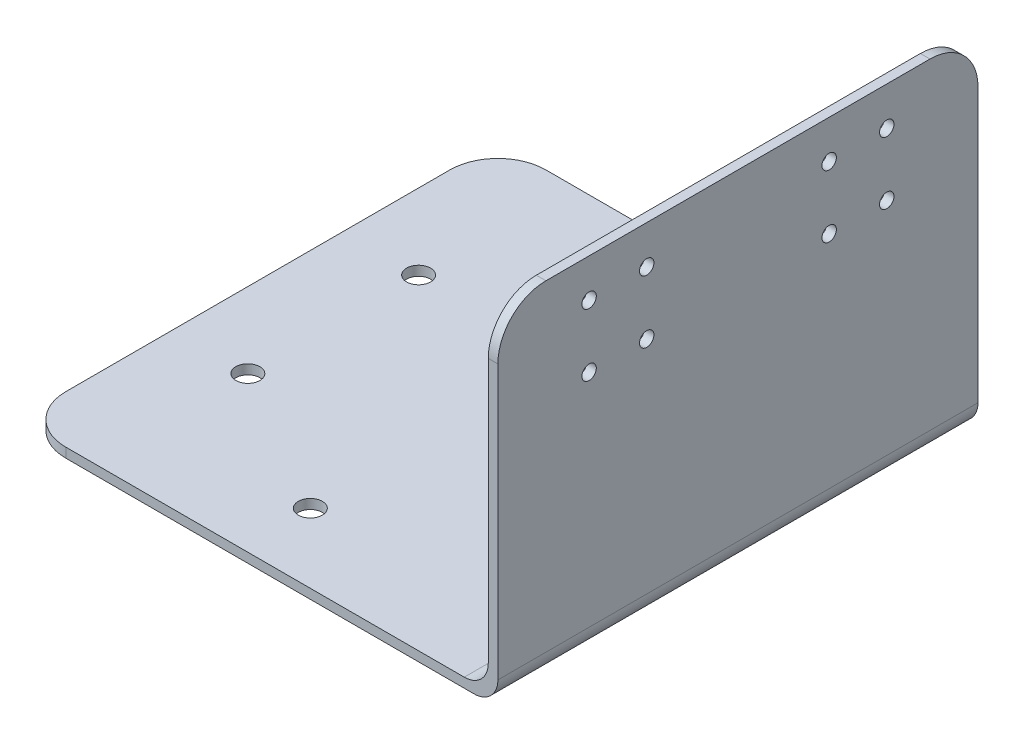
ISO-10303-21;
HEADER;
FILE_DESCRIPTION(('STEP AP214'),'2;1');
FILE_NAME('part.step','',(''),(''),'','','');
FILE_SCHEMA(('AUTOMOTIVE_DESIGN { 1 0 10303 214 1 1 1 1 }'));
ENDSEC;
DATA;
#1=APPLICATION_CONTEXT('core data for automotive mechanical design processes');
#2=APPLICATION_PROTOCOL_DEFINITION('international standard','automotive_design',2000,#1);
#3=PRODUCT_CONTEXT('',#1,'mechanical');
#4=PRODUCT('Part','Part','',(#3));
#5=PRODUCT_RELATED_PRODUCT_CATEGORY('part','',(#4));
#6=PRODUCT_DEFINITION_FORMATION('','',#4);
#7=PRODUCT_DEFINITION_CONTEXT('part definition',#1,'design');
#8=PRODUCT_DEFINITION('design','',#6,#7);
#9=PRODUCT_DEFINITION_SHAPE('','',#8);
#10=(LENGTH_UNIT() NAMED_UNIT(*) SI_UNIT(.MILLI.,.METRE.));
#11=(NAMED_UNIT(*) PLANE_ANGLE_UNIT() SI_UNIT($,.RADIAN.));
#12=(NAMED_UNIT(*) SI_UNIT($,.STERADIAN.) SOLID_ANGLE_UNIT());
#13=UNCERTAINTY_MEASURE_WITH_UNIT(LENGTH_MEASURE(1.E-05),#10,'distance_accuracy_value','');
#14=(GEOMETRIC_REPRESENTATION_CONTEXT(3) GLOBAL_UNCERTAINTY_ASSIGNED_CONTEXT((#13)) GLOBAL_UNIT_ASSIGNED_CONTEXT((#10,
#11,#12)) REPRESENTATION_CONTEXT('',''));
#15=CARTESIAN_POINT('',(0.,0.,0.));
#16=DIRECTION('',(0.,0.,1.));
#17=DIRECTION('',(1.,0.,0.));
#18=AXIS2_PLACEMENT_3D('',#15,#16,#17);
#19=CARTESIAN_POINT('',(-1.,25.,100.));
#20=DIRECTION('',(1.,0.,0.));
#21=DIRECTION('',(0.,1.,0.));
#22=AXIS2_PLACEMENT_3D('',#19,#20,#21);
#23=PLANE('',#22);
#24=CARTESIAN_POINT('',(-1.,4.00000000000003,19.));
#25=DIRECTION('',(-1.,0.,0.));
#26=DIRECTION('',(0.,-1.,0.));
#27=AXIS2_PLACEMENT_3D('',#24,#25,#26);
#28=CIRCLE('',#27,1.5);
#29=CARTESIAN_POINT('',(-1.,2.50000000000003,19.));
#30=VERTEX_POINT('',#29);
#31=EDGE_CURVE('E252',#30,#30,#28,.T.);
#32=ORIENTED_EDGE('',*,*,#31,.F.);
#33=EDGE_LOOP('',(#32));
#34=FACE_BOUND('',#33,.T.);
#35=CARTESIAN_POINT('',(-1.,17.,19.));
#36=DIRECTION('',(-1.,0.,0.));
#37=DIRECTION('',(0.,-1.,0.));
#38=AXIS2_PLACEMENT_3D('',#35,#36,#37);
#39=CIRCLE('',#38,1.5);
#40=CARTESIAN_POINT('',(-1.,15.5,19.));
#41=VERTEX_POINT('',#40);
#42=EDGE_CURVE('E246',#41,#41,#39,.T.);
#43=ORIENTED_EDGE('',*,*,#42,.F.);
#44=EDGE_LOOP('',(#43));
#45=FACE_BOUND('',#44,.T.);
#46=CARTESIAN_POINT('',(-1.,17.,81.));
#47=DIRECTION('',(-1.,0.,0.));
#48=DIRECTION('',(0.,1.,0.));
#49=AXIS2_PLACEMENT_3D('',#46,#47,#48);
#50=CIRCLE('',#49,1.5);
#51=CARTESIAN_POINT('',(-1.,18.5,81.));
#52=VERTEX_POINT('',#51);
#53=EDGE_CURVE('E240',#52,#52,#50,.T.);
#54=ORIENTED_EDGE('',*,*,#53,.F.);
#55=EDGE_LOOP('',(#54));
#56=FACE_BOUND('',#55,.T.);
#57=CARTESIAN_POINT('',(-1.,17.,69.));
#58=DIRECTION('',(-1.,0.,0.));
#59=DIRECTION('',(0.,1.,0.));
#60=AXIS2_PLACEMENT_3D('',#57,#58,#59);
#61=CIRCLE('',#60,1.50000000000001);
#62=CARTESIAN_POINT('',(-1.,18.5,69.));
#63=VERTEX_POINT('',#62);
#64=EDGE_CURVE('E233',#63,#63,#61,.T.);
#65=ORIENTED_EDGE('',*,*,#64,.F.);
#66=EDGE_LOOP('',(#65));
#67=FACE_BOUND('',#66,.T.);
#68=CARTESIAN_POINT('',(-1.,4.00000000000003,69.));
#69=DIRECTION('',(-1.,0.,0.));
#70=DIRECTION('',(0.,1.,0.));
#71=AXIS2_PLACEMENT_3D('',#68,#69,#70);
#72=CIRCLE('',#71,1.49999999999995);
#73=CARTESIAN_POINT('',(-1.,5.49999999999999,69.));
#74=VERTEX_POINT('',#73);
#75=EDGE_CURVE('E270',#74,#74,#72,.T.);
#76=ORIENTED_EDGE('',*,*,#75,.F.);
#77=EDGE_LOOP('',(#76));
#78=FACE_BOUND('',#77,.T.);
#79=CARTESIAN_POINT('',(-1.,4.00000000000003,31.));
#80=DIRECTION('',(-1.,0.,0.));
#81=DIRECTION('',(0.,-1.,0.));
#82=AXIS2_PLACEMENT_3D('',#79,#80,#81);
#83=CIRCLE('',#82,1.49999999999996);
#84=CARTESIAN_POINT('',(-1.,2.50000000000007,31.));
#85=VERTEX_POINT('',#84);
#86=EDGE_CURVE('E264',#85,#85,#83,.T.);
#87=ORIENTED_EDGE('',*,*,#86,.F.);
#88=EDGE_LOOP('',(#87));
#89=FACE_BOUND('',#88,.T.);
#90=CARTESIAN_POINT('',(-1.,4.00000000000004,81.));
#91=DIRECTION('',(-1.,0.,0.));
#92=DIRECTION('',(0.,1.,0.));
#93=AXIS2_PLACEMENT_3D('',#90,#91,#92);
#94=CIRCLE('',#93,1.5);
#95=CARTESIAN_POINT('',(-1.,5.50000000000003,81.));
#96=VERTEX_POINT('',#95);
#97=EDGE_CURVE('E257',#96,#96,#94,.T.);
#98=ORIENTED_EDGE('',*,*,#97,.F.);
#99=EDGE_LOOP('',(#98));
#100=FACE_BOUND('',#99,.T.);
#101=CARTESIAN_POINT('',(-1.,17.,31.));
#102=DIRECTION('',(-1.,0.,0.));
#103=DIRECTION('',(0.,-1.,0.));
#104=AXIS2_PLACEMENT_3D('',#101,#102,#103);
#105=CIRCLE('',#104,1.5);
#106=CARTESIAN_POINT('',(-1.,15.5,31.));
#107=VERTEX_POINT('',#106);
#108=EDGE_CURVE('E227',#107,#107,#105,.T.);
#109=ORIENTED_EDGE('',*,*,#108,.F.);
#110=EDGE_LOOP('',(#109));
#111=FACE_BOUND('',#110,.T.);
#112=DIRECTION('',(0.,0.,-1.));
#113=VECTOR('',#112,1.);
#114=CARTESIAN_POINT('',(-1.,25.,100.));
#115=LINE('',#114,#113);
#116=CARTESIAN_POINT('',(-1.,25.,90.));
#117=VERTEX_POINT('',#116);
#118=CARTESIAN_POINT('',(-1.,25.,9.99999999999999));
#119=VERTEX_POINT('',#118);
#120=EDGE_CURVE('E208',#117,#119,#115,.T.);
#121=ORIENTED_EDGE('',*,*,#120,.T.);
#122=CARTESIAN_POINT('',(-1.,15.,9.99999999999999));
#123=DIRECTION('',(1.,0.,0.));
#124=DIRECTION('',(0.,1.,0.));
#125=AXIS2_PLACEMENT_3D('',#122,#123,#124);
#126=CIRCLE('',#125,10.);
#127=CARTESIAN_POINT('',(-1.,15.,0.));
#128=VERTEX_POINT('',#127);
#129=EDGE_CURVE('E162',#119,#128,#126,.F.);
#130=ORIENTED_EDGE('',*,*,#129,.T.);
#131=DIRECTION('',(0.,-1.,0.));
#132=VECTOR('',#131,1.);
#133=CARTESIAN_POINT('',(-1.,25.,0.));
#134=LINE('',#133,#132);
#135=CARTESIAN_POINT('',(-0.999999999999997,-40.,0.));
#136=VERTEX_POINT('',#135);
#137=EDGE_CURVE('E148',#128,#136,#134,.T.);
#138=ORIENTED_EDGE('',*,*,#137,.T.);
#139=DIRECTION('',(0.,0.,-1.));
#140=VECTOR('',#139,1.);
#141=CARTESIAN_POINT('',(-0.999999999999997,-40.,100.));
#142=LINE('',#141,#140);
#143=CARTESIAN_POINT('',(-0.999999999999997,-40.,100.));
#144=VERTEX_POINT('',#143);
#145=EDGE_CURVE('E140',#144,#136,#142,.T.);
#146=ORIENTED_EDGE('',*,*,#145,.F.);
#147=DIRECTION('',(0.,-1.,0.));
#148=VECTOR('',#147,1.);
#149=CARTESIAN_POINT('',(-1.,25.,100.));
#150=LINE('',#149,#148);
#151=CARTESIAN_POINT('',(-1.,15.,100.));
#152=VERTEX_POINT('',#151);
#153=EDGE_CURVE('E124',#152,#144,#150,.T.);
#154=ORIENTED_EDGE('',*,*,#153,.F.);
#155=CARTESIAN_POINT('',(-1.,15.,90.));
#156=DIRECTION('',(1.,0.,0.));
#157=DIRECTION('',(0.,1.,0.));
#158=AXIS2_PLACEMENT_3D('',#155,#156,#157);
#159=CIRCLE('',#158,10.);
#160=EDGE_CURVE('E160',#152,#117,#159,.F.);
#161=ORIENTED_EDGE('',*,*,#160,.T.);
#162=EDGE_LOOP('',(#121,#130,#138,#146,#154,#161));
#163=FACE_BOUND('',#162,.T.);
#164=ADVANCED_FACE('F35',(#34,#45,#56,#67,#78,#89,#100,#111,#163),#23,.F.);
#165=CARTESIAN_POINT('',(-6.,-40.,100.));
#166=DIRECTION('',(0.,0.,-1.));
#167=DIRECTION('',(-1.,0.,0.));
#168=AXIS2_PLACEMENT_3D('',#165,#166,#167);
#169=CYLINDRICAL_SURFACE('',#168,5.);
#170=CARTESIAN_POINT('',(-6.,-40.,0.));
#171=DIRECTION('',(0.,0.,-1.));
#172=DIRECTION('',(-1.,0.,0.));
#173=AXIS2_PLACEMENT_3D('',#170,#171,#172);
#174=CIRCLE('',#173,5.);
#175=CARTESIAN_POINT('',(-5.99999999999999,-45.,0.));
#176=VERTEX_POINT('',#175);
#177=EDGE_CURVE('E219',#136,#176,#174,.T.);
#178=ORIENTED_EDGE('',*,*,#177,.T.);
#179=DIRECTION('',(0.,0.,-1.));
#180=VECTOR('',#179,1.);
#181=CARTESIAN_POINT('',(-5.99999999999999,-45.,100.));
#182=LINE('',#181,#180);
#183=CARTESIAN_POINT('',(-5.99999999999999,-45.,100.));
#184=VERTEX_POINT('',#183);
#185=EDGE_CURVE('E142',#184,#176,#182,.T.);
#186=ORIENTED_EDGE('',*,*,#185,.F.);
#187=CARTESIAN_POINT('',(-6.,-40.,100.));
#188=DIRECTION('',(0.,0.,-1.));
#189=DIRECTION('',(-1.,0.,0.));
#190=AXIS2_PLACEMENT_3D('',#187,#188,#189);
#191=CIRCLE('',#190,5.);
#192=EDGE_CURVE('E129',#144,#184,#191,.T.);
#193=ORIENTED_EDGE('',*,*,#192,.F.);
#194=ORIENTED_EDGE('',*,*,#145,.T.);
#195=EDGE_LOOP('',(#178,#186,#193,#194));
#196=FACE_BOUND('',#195,.T.);
#197=ADVANCED_FACE('F139',(#196),#169,.F.);
#198=CARTESIAN_POINT('',(-5.99999999999999,-45.,100.));
#199=DIRECTION('',(0.,-1.,0.));
#200=DIRECTION('',(1.,0.,0.));
#201=AXIS2_PLACEMENT_3D('',#198,#199,#200);
#202=PLANE('',#201);
#203=CARTESIAN_POINT('',(-52.5000000000061,-45.,14.4400000000013));
#204=DIRECTION('',(0.,1.,0.));
#205=DIRECTION('',(-1.,0.,0.));
#206=AXIS2_PLACEMENT_3D('',#203,#204,#205);
#207=CIRCLE('',#206,2.5);
#208=CARTESIAN_POINT('',(-55.0000000000061,-45.,14.4400000000013));
#209=VERTEX_POINT('',#208);
#210=EDGE_CURVE('E281',#209,#209,#207,.T.);
#211=ORIENTED_EDGE('',*,*,#210,.F.);
#212=EDGE_LOOP('',(#211));
#213=FACE_BOUND('',#212,.T.);
#214=CARTESIAN_POINT('',(-83.2958633585773,-45.,32.2200000000073));
#215=DIRECTION('',(0.,1.,0.));
#216=DIRECTION('',(-1.,0.,0.));
#217=AXIS2_PLACEMENT_3D('',#214,#215,#216);
#218=CIRCLE('',#217,2.5);
#219=CARTESIAN_POINT('',(-85.7958633585773,-45.,32.2200000000073));
#220=VERTEX_POINT('',#219);
#221=EDGE_CURVE('E287',#220,#220,#218,.T.);
#222=ORIENTED_EDGE('',*,*,#221,.F.);
#223=EDGE_LOOP('',(#222));
#224=FACE_BOUND('',#223,.T.);
#225=CARTESIAN_POINT('',(-83.2958633585704,-45.,67.7800000000074));
#226=DIRECTION('',(0.,1.,0.));
#227=DIRECTION('',(-1.,0.,0.));
#228=AXIS2_PLACEMENT_3D('',#225,#226,#227);
#229=CIRCLE('',#228,2.49999999999999);
#230=CARTESIAN_POINT('',(-85.7958633585704,-45.,67.7800000000074));
#231=VERTEX_POINT('',#230);
#232=EDGE_CURVE('E293',#231,#231,#229,.T.);
#233=ORIENTED_EDGE('',*,*,#232,.F.);
#234=EDGE_LOOP('',(#233));
#235=FACE_BOUND('',#234,.T.);
#236=CARTESIAN_POINT('',(-52.4999999999922,-45.,85.5600000000013));
#237=DIRECTION('',(0.,1.,0.));
#238=DIRECTION('',(-1.,0.,0.));
#239=AXIS2_PLACEMENT_3D('',#236,#237,#238);
#240=CIRCLE('',#239,2.5);
#241=CARTESIAN_POINT('',(-54.9999999999922,-45.,85.5600000000013));
#242=VERTEX_POINT('',#241);
#243=EDGE_CURVE('E299',#242,#242,#240,.T.);
#244=ORIENTED_EDGE('',*,*,#243,.F.);
#245=EDGE_LOOP('',(#244));
#246=FACE_BOUND('',#245,.T.);
#247=CARTESIAN_POINT('',(-21.7041366414211,-45.,67.7799999999951));
#248=DIRECTION('',(0.,1.,0.));
#249=DIRECTION('',(-1.,0.,0.));
#250=AXIS2_PLACEMENT_3D('',#247,#248,#249);
#251=CIRCLE('',#250,2.5);
#252=CARTESIAN_POINT('',(-24.2041366414211,-45.,67.7799999999951));
#253=VERTEX_POINT('',#252);
#254=EDGE_CURVE('E305',#253,#253,#251,.T.);
#255=ORIENTED_EDGE('',*,*,#254,.F.);
#256=EDGE_LOOP('',(#255));
#257=FACE_BOUND('',#256,.T.);
#258=CARTESIAN_POINT('',(-21.7041366414283,-45.,32.2199999999951));
#259=DIRECTION('',(0.,1.,0.));
#260=DIRECTION('',(-1.,0.,0.));
#261=AXIS2_PLACEMENT_3D('',#258,#259,#260);
#262=CIRCLE('',#261,2.5);
#263=CARTESIAN_POINT('',(-24.2041366414283,-45.,32.2199999999951));
#264=VERTEX_POINT('',#263);
#265=EDGE_CURVE('E275',#264,#264,#262,.T.);
#266=ORIENTED_EDGE('',*,*,#265,.F.);
#267=EDGE_LOOP('',(#266));
#268=FACE_BOUND('',#267,.T.);
#269=DIRECTION('',(-1.,0.,0.));
#270=VECTOR('',#269,1.);
#271=CARTESIAN_POINT('',(-5.99999999999999,-45.,0.));
#272=LINE('',#271,#270);
#273=CARTESIAN_POINT('',(-89.,-45.,0.));
#274=VERTEX_POINT('',#273);
#275=EDGE_CURVE('E217',#176,#274,#272,.T.);
#276=ORIENTED_EDGE('',*,*,#275,.T.);
#277=CARTESIAN_POINT('',(-89.,-45.,9.99999999999999));
#278=DIRECTION('',(0.,-1.,0.));
#279=DIRECTION('',(1.,0.,0.));
#280=AXIS2_PLACEMENT_3D('',#277,#278,#279);
#281=CIRCLE('',#280,10.);
#282=CARTESIAN_POINT('',(-99.,-45.,9.99999999999999));
#283=VERTEX_POINT('',#282);
#284=EDGE_CURVE('E11',#274,#283,#281,.F.);
#285=ORIENTED_EDGE('',*,*,#284,.T.);
#286=DIRECTION('',(0.,0.,-1.));
#287=VECTOR('',#286,1.);
#288=CARTESIAN_POINT('',(-99.,-45.,100.));
#289=LINE('',#288,#287);
#290=CARTESIAN_POINT('',(-99.,-45.,90.));
#291=VERTEX_POINT('',#290);
#292=EDGE_CURVE('E154',#291,#283,#289,.T.);
#293=ORIENTED_EDGE('',*,*,#292,.F.);
#294=CARTESIAN_POINT('',(-89.,-45.,90.));
#295=DIRECTION('',(0.,-1.,0.));
#296=DIRECTION('',(1.,0.,0.));
#297=AXIS2_PLACEMENT_3D('',#294,#295,#296);
#298=CIRCLE('',#297,10.);
#299=CARTESIAN_POINT('',(-89.,-45.,100.));
#300=VERTEX_POINT('',#299);
#301=EDGE_CURVE('E43',#291,#300,#298,.F.);
#302=ORIENTED_EDGE('',*,*,#301,.T.);
#303=DIRECTION('',(-1.,0.,0.));
#304=VECTOR('',#303,1.);
#305=CARTESIAN_POINT('',(-5.99999999999999,-45.,100.));
#306=LINE('',#305,#304);
#307=EDGE_CURVE('E144',#184,#300,#306,.T.);
#308=ORIENTED_EDGE('',*,*,#307,.F.);
#309=ORIENTED_EDGE('',*,*,#185,.T.);
#310=EDGE_LOOP('',(#276,#285,#293,#302,#308,#309));
#311=FACE_BOUND('',#310,.T.);
#312=ADVANCED_FACE('F184',(#213,#224,#235,#246,#257,#268,#311),#202,.F.);
#313=CARTESIAN_POINT('',(-99.,-45.,100.));
#314=DIRECTION('',(1.,0.,0.));
#315=DIRECTION('',(0.,0.,-1.));
#316=AXIS2_PLACEMENT_3D('',#313,#314,#315);
#317=PLANE('',#316);
#318=ORIENTED_EDGE('',*,*,#292,.T.);
#319=DIRECTION('',(0.,-1.,0.));
#320=VECTOR('',#319,1.);
#321=CARTESIAN_POINT('',(-99.,-47.,9.99999999999999));
#322=LINE('',#321,#320);
#323=CARTESIAN_POINT('',(-99.,-47.,9.99999999999999));
#324=VERTEX_POINT('',#323);
#325=EDGE_CURVE('E177',#283,#324,#322,.T.);
#326=ORIENTED_EDGE('',*,*,#325,.T.);
#327=DIRECTION('',(0.,0.,-1.));
#328=VECTOR('',#327,1.);
#329=CARTESIAN_POINT('',(-99.,-47.,100.));
#330=LINE('',#329,#328);
#331=CARTESIAN_POINT('',(-99.,-47.,90.));
#332=VERTEX_POINT('',#331);
#333=EDGE_CURVE('E193',#332,#324,#330,.T.);
#334=ORIENTED_EDGE('',*,*,#333,.F.);
#335=DIRECTION('',(0.,-1.,0.));
#336=VECTOR('',#335,1.);
#337=CARTESIAN_POINT('',(-99.,-45.,90.));
#338=LINE('',#337,#336);
#339=EDGE_CURVE('E55',#332,#291,#338,.F.);
#340=ORIENTED_EDGE('',*,*,#339,.T.);
#341=EDGE_LOOP('',(#318,#326,#334,#340));
#342=FACE_BOUND('',#341,.T.);
#343=ADVANCED_FACE('F195',(#342),#317,.F.);
#344=CARTESIAN_POINT('',(-3.99999999999999,-47.,100.));
#345=DIRECTION('',(0.,1.,0.));
#346=DIRECTION('',(-1.,0.,0.));
#347=AXIS2_PLACEMENT_3D('',#344,#345,#346);
#348=PLANE('',#347);
#349=CARTESIAN_POINT('',(-52.5000000000061,-47.,14.4400000000013));
#350=DIRECTION('',(0.,1.,0.));
#351=DIRECTION('',(-1.,0.,0.));
#352=AXIS2_PLACEMENT_3D('',#349,#350,#351);
#353=CIRCLE('',#352,2.5);
#354=CARTESIAN_POINT('',(-55.0000000000061,-47.,14.4400000000013));
#355=VERTEX_POINT('',#354);
#356=EDGE_CURVE('E284',#355,#355,#353,.T.);
#357=ORIENTED_EDGE('',*,*,#356,.T.);
#358=EDGE_LOOP('',(#357));
#359=FACE_BOUND('',#358,.T.);
#360=CARTESIAN_POINT('',(-83.2958633585773,-47.,32.2200000000073));
#361=DIRECTION('',(0.,1.,0.));
#362=DIRECTION('',(-1.,0.,0.));
#363=AXIS2_PLACEMENT_3D('',#360,#361,#362);
#364=CIRCLE('',#363,2.5);
#365=CARTESIAN_POINT('',(-85.7958633585773,-47.,32.2200000000073));
#366=VERTEX_POINT('',#365);
#367=EDGE_CURVE('E290',#366,#366,#364,.T.);
#368=ORIENTED_EDGE('',*,*,#367,.T.);
#369=EDGE_LOOP('',(#368));
#370=FACE_BOUND('',#369,.T.);
#371=CARTESIAN_POINT('',(-83.2958633585704,-47.,67.7800000000074));
#372=DIRECTION('',(0.,1.,0.));
#373=DIRECTION('',(-1.,0.,0.));
#374=AXIS2_PLACEMENT_3D('',#371,#372,#373);
#375=CIRCLE('',#374,2.49999999999999);
#376=CARTESIAN_POINT('',(-85.7958633585704,-47.,67.7800000000074));
#377=VERTEX_POINT('',#376);
#378=EDGE_CURVE('E296',#377,#377,#375,.T.);
#379=ORIENTED_EDGE('',*,*,#378,.T.);
#380=EDGE_LOOP('',(#379));
#381=FACE_BOUND('',#380,.T.);
#382=CARTESIAN_POINT('',(-52.4999999999922,-47.,85.5600000000013));
#383=DIRECTION('',(0.,1.,0.));
#384=DIRECTION('',(-1.,0.,0.));
#385=AXIS2_PLACEMENT_3D('',#382,#383,#384);
#386=CIRCLE('',#385,2.5);
#387=CARTESIAN_POINT('',(-54.9999999999922,-47.,85.5600000000013));
#388=VERTEX_POINT('',#387);
#389=EDGE_CURVE('E302',#388,#388,#386,.T.);
#390=ORIENTED_EDGE('',*,*,#389,.T.);
#391=EDGE_LOOP('',(#390));
#392=FACE_BOUND('',#391,.T.);
#393=CARTESIAN_POINT('',(-21.7041366414211,-47.,67.7799999999951));
#394=DIRECTION('',(0.,1.,0.));
#395=DIRECTION('',(-1.,0.,0.));
#396=AXIS2_PLACEMENT_3D('',#393,#394,#395);
#397=CIRCLE('',#396,2.5);
#398=CARTESIAN_POINT('',(-24.2041366414211,-47.,67.7799999999951));
#399=VERTEX_POINT('',#398);
#400=EDGE_CURVE('E278',#399,#399,#397,.T.);
#401=ORIENTED_EDGE('',*,*,#400,.T.);
#402=EDGE_LOOP('',(#401));
#403=FACE_BOUND('',#402,.T.);
#404=CARTESIAN_POINT('',(-21.7041366414283,-47.,32.2199999999951));
#405=DIRECTION('',(0.,1.,0.));
#406=DIRECTION('',(-1.,0.,0.));
#407=AXIS2_PLACEMENT_3D('',#404,#405,#406);
#408=CIRCLE('',#407,2.5);
#409=CARTESIAN_POINT('',(-24.2041366414283,-47.,32.2199999999951));
#410=VERTEX_POINT('',#409);
#411=EDGE_CURVE('E261',#410,#410,#408,.T.);
#412=ORIENTED_EDGE('',*,*,#411,.T.);
#413=EDGE_LOOP('',(#412));
#414=FACE_BOUND('',#413,.T.);
#415=ORIENTED_EDGE('',*,*,#333,.T.);
#416=CARTESIAN_POINT('',(-89.,-47.,9.99999999999999));
#417=DIRECTION('',(0.,1.,0.));
#418=DIRECTION('',(-1.,0.,0.));
#419=AXIS2_PLACEMENT_3D('',#416,#417,#418);
#420=CIRCLE('',#419,10.);
#421=CARTESIAN_POINT('',(-89.,-47.,0.));
#422=VERTEX_POINT('',#421);
#423=EDGE_CURVE('E182',#324,#422,#420,.F.);
#424=ORIENTED_EDGE('',*,*,#423,.T.);
#425=DIRECTION('',(1.,0.,0.));
#426=VECTOR('',#425,1.);
#427=CARTESIAN_POINT('',(-3.99999999999999,-47.,0.));
#428=LINE('',#427,#426);
#429=CARTESIAN_POINT('',(-3.99999999999999,-47.,0.));
#430=VERTEX_POINT('',#429);
#431=EDGE_CURVE('E215',#422,#430,#428,.T.);
#432=ORIENTED_EDGE('',*,*,#431,.T.);
#433=DIRECTION('',(0.,0.,-1.));
#434=VECTOR('',#433,1.);
#435=CARTESIAN_POINT('',(-3.99999999999999,-47.,100.));
#436=LINE('',#435,#434);
#437=CARTESIAN_POINT('',(-3.99999999999999,-47.,100.));
#438=VERTEX_POINT('',#437);
#439=EDGE_CURVE('E197',#438,#430,#436,.T.);
#440=ORIENTED_EDGE('',*,*,#439,.F.);
#441=DIRECTION('',(1.,0.,0.));
#442=VECTOR('',#441,1.);
#443=CARTESIAN_POINT('',(-3.99999999999999,-47.,100.));
#444=LINE('',#443,#442);
#445=CARTESIAN_POINT('',(-89.,-47.,100.));
#446=VERTEX_POINT('',#445);
#447=EDGE_CURVE('E188',#446,#438,#444,.T.);
#448=ORIENTED_EDGE('',*,*,#447,.F.);
#449=CARTESIAN_POINT('',(-89.,-47.,90.));
#450=DIRECTION('',(0.,1.,0.));
#451=DIRECTION('',(-1.,0.,0.));
#452=AXIS2_PLACEMENT_3D('',#449,#450,#451);
#453=CIRCLE('',#452,10.);
#454=EDGE_CURVE('E180',#446,#332,#453,.F.);
#455=ORIENTED_EDGE('',*,*,#454,.T.);
#456=EDGE_LOOP('',(#415,#424,#432,#440,#448,#455));
#457=FACE_BOUND('',#456,.T.);
#458=ADVANCED_FACE('F192',(#359,#370,#381,#392,#403,#414,#457),#348,.F.);
#459=CARTESIAN_POINT('',(-3.99999999999999,-42.,100.));
#460=DIRECTION('',(0.,0.,-1.));
#461=DIRECTION('',(-1.,0.,0.));
#462=AXIS2_PLACEMENT_3D('',#459,#460,#461);
#463=CYLINDRICAL_SURFACE('',#462,5.);
#464=CARTESIAN_POINT('',(-3.99999999999999,-42.,0.));
#465=DIRECTION('',(0.,0.,1.));
#466=DIRECTION('',(1.,0.,0.));
#467=AXIS2_PLACEMENT_3D('',#464,#465,#466);
#468=CIRCLE('',#467,5.);
#469=CARTESIAN_POINT('',(1.00000000000001,-42.,0.));
#470=VERTEX_POINT('',#469);
#471=EDGE_CURVE('E213',#430,#470,#468,.T.);
#472=ORIENTED_EDGE('',*,*,#471,.T.);
#473=DIRECTION('',(0.,0.,-1.));
#474=VECTOR('',#473,1.);
#475=CARTESIAN_POINT('',(1.00000000000001,-42.,100.));
#476=LINE('',#475,#474);
#477=CARTESIAN_POINT('',(1.00000000000001,-42.,100.));
#478=VERTEX_POINT('',#477);
#479=EDGE_CURVE('E200',#478,#470,#476,.T.);
#480=ORIENTED_EDGE('',*,*,#479,.F.);
#481=CARTESIAN_POINT('',(-3.99999999999999,-42.,100.));
#482=DIRECTION('',(0.,0.,1.));
#483=DIRECTION('',(1.,0.,0.));
#484=AXIS2_PLACEMENT_3D('',#481,#482,#483);
#485=CIRCLE('',#484,5.);
#486=EDGE_CURVE('E224',#438,#478,#485,.T.);
#487=ORIENTED_EDGE('',*,*,#486,.F.);
#488=ORIENTED_EDGE('',*,*,#439,.T.);
#489=EDGE_LOOP('',(#472,#480,#487,#488));
#490=FACE_BOUND('',#489,.T.);
#491=ADVANCED_FACE('F373',(#490),#463,.T.);
#492=CARTESIAN_POINT('',(0.999999999999997,25.,100.));
#493=DIRECTION('',(-1.,0.,0.));
#494=DIRECTION('',(0.,-1.,0.));
#495=AXIS2_PLACEMENT_3D('',#492,#493,#494);
#496=PLANE('',#495);
#497=CARTESIAN_POINT('',(1.00000000000001,4.00000000000003,19.));
#498=DIRECTION('',(-1.,0.,0.));
#499=DIRECTION('',(0.,-1.,0.));
#500=AXIS2_PLACEMENT_3D('',#497,#498,#499);
#501=CIRCLE('',#500,1.5);
#502=CARTESIAN_POINT('',(1.00000000000001,2.50000000000003,19.));
#503=VERTEX_POINT('',#502);
#504=EDGE_CURVE('E230',#503,#503,#501,.T.);
#505=ORIENTED_EDGE('',*,*,#504,.T.);
#506=EDGE_LOOP('',(#505));
#507=FACE_BOUND('',#506,.T.);
#508=CARTESIAN_POINT('',(1.00000000000001,17.,19.));
#509=DIRECTION('',(-1.,0.,0.));
#510=DIRECTION('',(0.,-1.,0.));
#511=AXIS2_PLACEMENT_3D('',#508,#509,#510);
#512=CIRCLE('',#511,1.5);
#513=CARTESIAN_POINT('',(1.00000000000001,15.5,19.));
#514=VERTEX_POINT('',#513);
#515=EDGE_CURVE('E249',#514,#514,#512,.T.);
#516=ORIENTED_EDGE('',*,*,#515,.T.);
#517=EDGE_LOOP('',(#516));
#518=FACE_BOUND('',#517,.T.);
#519=CARTESIAN_POINT('',(1.00000000000001,17.,81.));
#520=DIRECTION('',(-1.,0.,0.));
#521=DIRECTION('',(0.,1.,0.));
#522=AXIS2_PLACEMENT_3D('',#519,#520,#521);
#523=CIRCLE('',#522,1.5);
#524=CARTESIAN_POINT('',(1.00000000000001,18.5,81.));
#525=VERTEX_POINT('',#524);
#526=EDGE_CURVE('E243',#525,#525,#523,.T.);
#527=ORIENTED_EDGE('',*,*,#526,.T.);
#528=EDGE_LOOP('',(#527));
#529=FACE_BOUND('',#528,.T.);
#530=CARTESIAN_POINT('',(1.00000000000001,17.,69.));
#531=DIRECTION('',(-1.,0.,0.));
#532=DIRECTION('',(0.,1.,0.));
#533=AXIS2_PLACEMENT_3D('',#530,#531,#532);
#534=CIRCLE('',#533,1.50000000000001);
#535=CARTESIAN_POINT('',(1.00000000000001,18.5,69.));
#536=VERTEX_POINT('',#535);
#537=EDGE_CURVE('E236',#536,#536,#534,.T.);
#538=ORIENTED_EDGE('',*,*,#537,.T.);
#539=EDGE_LOOP('',(#538));
#540=FACE_BOUND('',#539,.T.);
#541=CARTESIAN_POINT('',(1.00000000000001,4.00000000000003,69.));
#542=DIRECTION('',(-1.,0.,0.));
#543=DIRECTION('',(0.,1.,0.));
#544=AXIS2_PLACEMENT_3D('',#541,#542,#543);
#545=CIRCLE('',#544,1.49999999999995);
#546=CARTESIAN_POINT('',(1.00000000000001,5.49999999999999,69.));
#547=VERTEX_POINT('',#546);
#548=EDGE_CURVE('E237',#547,#547,#545,.T.);
#549=ORIENTED_EDGE('',*,*,#548,.T.);
#550=EDGE_LOOP('',(#549));
#551=FACE_BOUND('',#550,.T.);
#552=CARTESIAN_POINT('',(1.00000000000001,4.00000000000003,31.));
#553=DIRECTION('',(-1.,0.,0.));
#554=DIRECTION('',(0.,-1.,0.));
#555=AXIS2_PLACEMENT_3D('',#552,#553,#554);
#556=CIRCLE('',#555,1.49999999999996);
#557=CARTESIAN_POINT('',(1.00000000000001,2.50000000000007,31.));
#558=VERTEX_POINT('',#557);
#559=EDGE_CURVE('E267',#558,#558,#556,.T.);
#560=ORIENTED_EDGE('',*,*,#559,.T.);
#561=EDGE_LOOP('',(#560));
#562=FACE_BOUND('',#561,.T.);
#563=CARTESIAN_POINT('',(1.00000000000001,4.00000000000004,81.));
#564=DIRECTION('',(-1.,0.,0.));
#565=DIRECTION('',(0.,1.,0.));
#566=AXIS2_PLACEMENT_3D('',#563,#564,#565);
#567=CIRCLE('',#566,1.5);
#568=CARTESIAN_POINT('',(1.00000000000001,5.50000000000003,81.));
#569=VERTEX_POINT('',#568);
#570=EDGE_CURVE('E260',#569,#569,#567,.T.);
#571=ORIENTED_EDGE('',*,*,#570,.T.);
#572=EDGE_LOOP('',(#571));
#573=FACE_BOUND('',#572,.T.);
#574=CARTESIAN_POINT('',(1.00000000000001,17.,31.));
#575=DIRECTION('',(-1.,0.,0.));
#576=DIRECTION('',(0.,-1.,0.));
#577=AXIS2_PLACEMENT_3D('',#574,#575,#576);
#578=CIRCLE('',#577,1.5);
#579=CARTESIAN_POINT('',(1.00000000000001,15.5,31.));
#580=VERTEX_POINT('',#579);
#581=EDGE_CURVE('E222',#580,#580,#578,.T.);
#582=ORIENTED_EDGE('',*,*,#581,.T.);
#583=EDGE_LOOP('',(#582));
#584=FACE_BOUND('',#583,.T.);
#585=DIRECTION('',(0.,1.,0.));
#586=VECTOR('',#585,1.);
#587=CARTESIAN_POINT('',(0.999999999999997,25.,0.));
#588=LINE('',#587,#586);
#589=CARTESIAN_POINT('',(0.999999999999998,15.,0.));
#590=VERTEX_POINT('',#589);
#591=EDGE_CURVE('E135',#470,#590,#588,.T.);
#592=ORIENTED_EDGE('',*,*,#591,.T.);
#593=CARTESIAN_POINT('',(0.999999999999998,15.,9.99999999999999));
#594=DIRECTION('',(-1.,0.,0.));
#595=DIRECTION('',(0.,-1.,0.));
#596=AXIS2_PLACEMENT_3D('',#593,#594,#595);
#597=CIRCLE('',#596,10.);
#598=CARTESIAN_POINT('',(0.999999999999997,25.,9.99999999999999));
#599=VERTEX_POINT('',#598);
#600=EDGE_CURVE('E170',#590,#599,#597,.F.);
#601=ORIENTED_EDGE('',*,*,#600,.T.);
#602=DIRECTION('',(0.,0.,-1.));
#603=VECTOR('',#602,1.);
#604=CARTESIAN_POINT('',(0.999999999999997,25.,100.));
#605=LINE('',#604,#603);
#606=CARTESIAN_POINT('',(0.999999999999997,25.,90.));
#607=VERTEX_POINT('',#606);
#608=EDGE_CURVE('E205',#607,#599,#605,.T.);
#609=ORIENTED_EDGE('',*,*,#608,.F.);
#610=CARTESIAN_POINT('',(0.999999999999998,15.,90.));
#611=DIRECTION('',(-1.,0.,0.));
#612=DIRECTION('',(0.,-1.,0.));
#613=AXIS2_PLACEMENT_3D('',#610,#611,#612);
#614=CIRCLE('',#613,10.);
#615=CARTESIAN_POINT('',(0.999999999999998,15.,100.));
#616=VERTEX_POINT('',#615);
#617=EDGE_CURVE('E168',#607,#616,#614,.F.);
#618=ORIENTED_EDGE('',*,*,#617,.T.);
#619=DIRECTION('',(0.,1.,0.));
#620=VECTOR('',#619,1.);
#621=CARTESIAN_POINT('',(0.999999999999997,25.,100.));
#622=LINE('',#621,#620);
#623=EDGE_CURVE('E210',#478,#616,#622,.T.);
#624=ORIENTED_EDGE('',*,*,#623,.F.);
#625=ORIENTED_EDGE('',*,*,#479,.T.);
#626=EDGE_LOOP('',(#592,#601,#609,#618,#624,#625));
#627=FACE_BOUND('',#626,.T.);
#628=ADVANCED_FACE('F377',(#507,#518,#529,#540,#551,#562,#573,#584,#627),#496,.F.);
#629=CARTESIAN_POINT('',(-1.,25.,100.));
#630=DIRECTION('',(0.,-1.,0.));
#631=DIRECTION('',(0.,0.,-1.));
#632=AXIS2_PLACEMENT_3D('',#629,#630,#631);
#633=PLANE('',#632);
#634=ORIENTED_EDGE('',*,*,#608,.T.);
#635=DIRECTION('',(-1.,0.,0.));
#636=VECTOR('',#635,1.);
#637=CARTESIAN_POINT('',(-1.,25.,9.99999999999999));
#638=LINE('',#637,#636);
#639=EDGE_CURVE('E152',#599,#119,#638,.T.);
#640=ORIENTED_EDGE('',*,*,#639,.T.);
#641=ORIENTED_EDGE('',*,*,#120,.F.);
#642=DIRECTION('',(-1.,0.,0.));
#643=VECTOR('',#642,1.);
#644=CARTESIAN_POINT('',(-1.,25.,90.));
#645=LINE('',#644,#643);
#646=EDGE_CURVE('E150',#117,#607,#645,.F.);
#647=ORIENTED_EDGE('',*,*,#646,.T.);
#648=EDGE_LOOP('',(#634,#640,#641,#647));
#649=FACE_BOUND('',#648,.T.);
#650=ADVANCED_FACE('F384',(#649),#633,.F.);
#651=CARTESIAN_POINT('',(-6.,-40.,100.));
#652=DIRECTION('',(0.,0.,-1.));
#653=DIRECTION('',(-1.,0.,0.));
#654=AXIS2_PLACEMENT_3D('',#651,#652,#653);
#655=PLANE('',#654);
#656=ORIENTED_EDGE('',*,*,#623,.T.);
#657=DIRECTION('',(-1.,0.,0.));
#658=VECTOR('',#657,1.);
#659=CARTESIAN_POINT('',(-6.,15.,100.));
#660=LINE('',#659,#658);
#661=EDGE_CURVE('E132',#616,#152,#660,.T.);
#662=ORIENTED_EDGE('',*,*,#661,.T.);
#663=ORIENTED_EDGE('',*,*,#153,.T.);
#664=ORIENTED_EDGE('',*,*,#192,.T.);
#665=ORIENTED_EDGE('',*,*,#307,.T.);
#666=DIRECTION('',(0.,-1.,0.));
#667=VECTOR('',#666,1.);
#668=CARTESIAN_POINT('',(-89.,-40.,100.));
#669=LINE('',#668,#667);
#670=EDGE_CURVE('E172',#300,#446,#669,.T.);
#671=ORIENTED_EDGE('',*,*,#670,.T.);
#672=ORIENTED_EDGE('',*,*,#447,.T.);
#673=ORIENTED_EDGE('',*,*,#486,.T.);
#674=EDGE_LOOP('',(#656,#662,#663,#664,#665,#671,#672,#673));
#675=FACE_BOUND('',#674,.T.);
#676=ADVANCED_FACE('F127',(#675),#655,.F.);
#677=CARTESIAN_POINT('',(-6.,-40.,0.));
#678=DIRECTION('',(0.,0.,-1.));
#679=DIRECTION('',(-1.,0.,0.));
#680=AXIS2_PLACEMENT_3D('',#677,#678,#679);
#681=PLANE('',#680);
#682=ORIENTED_EDGE('',*,*,#137,.F.);
#683=DIRECTION('',(-1.,0.,0.));
#684=VECTOR('',#683,1.);
#685=CARTESIAN_POINT('',(0.999999999999997,15.,0.));
#686=LINE('',#685,#684);
#687=EDGE_CURVE('E166',#128,#590,#686,.F.);
#688=ORIENTED_EDGE('',*,*,#687,.T.);
#689=ORIENTED_EDGE('',*,*,#591,.F.);
#690=ORIENTED_EDGE('',*,*,#471,.F.);
#691=ORIENTED_EDGE('',*,*,#431,.F.);
#692=DIRECTION('',(0.,-1.,0.));
#693=VECTOR('',#692,1.);
#694=CARTESIAN_POINT('',(-89.,-45.,0.));
#695=LINE('',#694,#693);
#696=EDGE_CURVE('E164',#422,#274,#695,.F.);
#697=ORIENTED_EDGE('',*,*,#696,.T.);
#698=ORIENTED_EDGE('',*,*,#275,.F.);
#699=ORIENTED_EDGE('',*,*,#177,.F.);
#700=EDGE_LOOP('',(#682,#688,#689,#690,#691,#697,#698,#699));
#701=FACE_BOUND('',#700,.T.);
#702=ADVANCED_FACE('F368',(#701),#681,.T.);
#703=CARTESIAN_POINT('',(1.00000000000001,17.,31.));
#704=DIRECTION('',(-1.,0.,0.));
#705=DIRECTION('',(0.,-1.,0.));
#706=AXIS2_PLACEMENT_3D('',#703,#704,#705);
#707=CYLINDRICAL_SURFACE('',#706,1.5);
#708=ORIENTED_EDGE('',*,*,#581,.F.);
#709=EDGE_LOOP('',(#708));
#710=FACE_BOUND('',#709,.T.);
#711=ORIENTED_EDGE('',*,*,#108,.T.);
#712=EDGE_LOOP('',(#711));
#713=FACE_BOUND('',#712,.T.);
#714=ADVANCED_FACE('F441',(#710,#713),#707,.F.);
#715=CARTESIAN_POINT('',(1.00000000000001,4.00000000000004,81.));
#716=DIRECTION('',(-1.,0.,0.));
#717=DIRECTION('',(0.,-1.,0.));
#718=AXIS2_PLACEMENT_3D('',#715,#716,#717);
#719=CYLINDRICAL_SURFACE('',#718,1.5);
#720=ORIENTED_EDGE('',*,*,#570,.F.);
#721=EDGE_LOOP('',(#720));
#722=FACE_BOUND('',#721,.T.);
#723=ORIENTED_EDGE('',*,*,#97,.T.);
#724=EDGE_LOOP('',(#723));
#725=FACE_BOUND('',#724,.T.);
#726=ADVANCED_FACE('F557',(#722,#725),#719,.F.);
#727=CARTESIAN_POINT('',(1.00000000000001,4.00000000000003,31.));
#728=DIRECTION('',(-1.,0.,0.));
#729=DIRECTION('',(0.,-1.,0.));
#730=AXIS2_PLACEMENT_3D('',#727,#728,#729);
#731=CYLINDRICAL_SURFACE('',#730,1.49999999999996);
#732=ORIENTED_EDGE('',*,*,#559,.F.);
#733=EDGE_LOOP('',(#732));
#734=FACE_BOUND('',#733,.T.);
#735=ORIENTED_EDGE('',*,*,#86,.T.);
#736=EDGE_LOOP('',(#735));
#737=FACE_BOUND('',#736,.T.);
#738=ADVANCED_FACE('F548',(#734,#737),#731,.F.);
#739=CARTESIAN_POINT('',(1.00000000000001,4.00000000000003,69.));
#740=DIRECTION('',(-1.,0.,0.));
#741=DIRECTION('',(0.,-1.,0.));
#742=AXIS2_PLACEMENT_3D('',#739,#740,#741);
#743=CYLINDRICAL_SURFACE('',#742,1.49999999999995);
#744=ORIENTED_EDGE('',*,*,#548,.F.);
#745=EDGE_LOOP('',(#744));
#746=FACE_BOUND('',#745,.T.);
#747=ORIENTED_EDGE('',*,*,#75,.T.);
#748=EDGE_LOOP('',(#747));
#749=FACE_BOUND('',#748,.T.);
#750=ADVANCED_FACE('F538',(#746,#749),#743,.F.);
#751=CARTESIAN_POINT('',(1.00000000000001,17.,69.));
#752=DIRECTION('',(-1.,0.,0.));
#753=DIRECTION('',(0.,-1.,0.));
#754=AXIS2_PLACEMENT_3D('',#751,#752,#753);
#755=CYLINDRICAL_SURFACE('',#754,1.50000000000001);
#756=ORIENTED_EDGE('',*,*,#537,.F.);
#757=EDGE_LOOP('',(#756));
#758=FACE_BOUND('',#757,.T.);
#759=ORIENTED_EDGE('',*,*,#64,.T.);
#760=EDGE_LOOP('',(#759));
#761=FACE_BOUND('',#760,.T.);
#762=ADVANCED_FACE('F528',(#758,#761),#755,.F.);
#763=CARTESIAN_POINT('',(1.00000000000001,17.,81.));
#764=DIRECTION('',(-1.,0.,0.));
#765=DIRECTION('',(0.,-1.,0.));
#766=AXIS2_PLACEMENT_3D('',#763,#764,#765);
#767=CYLINDRICAL_SURFACE('',#766,1.5);
#768=ORIENTED_EDGE('',*,*,#526,.F.);
#769=EDGE_LOOP('',(#768));
#770=FACE_BOUND('',#769,.T.);
#771=ORIENTED_EDGE('',*,*,#53,.T.);
#772=EDGE_LOOP('',(#771));
#773=FACE_BOUND('',#772,.T.);
#774=ADVANCED_FACE('F518',(#770,#773),#767,.F.);
#775=CARTESIAN_POINT('',(1.00000000000001,17.,19.));
#776=DIRECTION('',(-1.,0.,0.));
#777=DIRECTION('',(0.,-1.,0.));
#778=AXIS2_PLACEMENT_3D('',#775,#776,#777);
#779=CYLINDRICAL_SURFACE('',#778,1.5);
#780=ORIENTED_EDGE('',*,*,#515,.F.);
#781=EDGE_LOOP('',(#780));
#782=FACE_BOUND('',#781,.T.);
#783=ORIENTED_EDGE('',*,*,#42,.T.);
#784=EDGE_LOOP('',(#783));
#785=FACE_BOUND('',#784,.T.);
#786=ADVANCED_FACE('F334',(#782,#785),#779,.F.);
#787=CARTESIAN_POINT('',(1.00000000000001,4.00000000000003,19.));
#788=DIRECTION('',(-1.,0.,0.));
#789=DIRECTION('',(0.,-1.,0.));
#790=AXIS2_PLACEMENT_3D('',#787,#788,#789);
#791=CYLINDRICAL_SURFACE('',#790,1.5);
#792=ORIENTED_EDGE('',*,*,#504,.F.);
#793=EDGE_LOOP('',(#792));
#794=FACE_BOUND('',#793,.T.);
#795=ORIENTED_EDGE('',*,*,#31,.T.);
#796=EDGE_LOOP('',(#795));
#797=FACE_BOUND('',#796,.T.);
#798=ADVANCED_FACE('F328',(#794,#797),#791,.F.);
#799=CARTESIAN_POINT('',(-21.7041366414283,-47.,32.2199999999951));
#800=DIRECTION('',(0.,1.,0.));
#801=DIRECTION('',(-1.,0.,0.));
#802=AXIS2_PLACEMENT_3D('',#799,#800,#801);
#803=CYLINDRICAL_SURFACE('',#802,2.5);
#804=ORIENTED_EDGE('',*,*,#411,.F.);
#805=EDGE_LOOP('',(#804));
#806=FACE_BOUND('',#805,.T.);
#807=ORIENTED_EDGE('',*,*,#265,.T.);
#808=EDGE_LOOP('',(#807));
#809=FACE_BOUND('',#808,.T.);
#810=ADVANCED_FACE('F317',(#806,#809),#803,.F.);
#811=CARTESIAN_POINT('',(-21.7041366414211,-47.,67.7799999999951));
#812=DIRECTION('',(0.,1.,0.));
#813=DIRECTION('',(-1.,0.,0.));
#814=AXIS2_PLACEMENT_3D('',#811,#812,#813);
#815=CYLINDRICAL_SURFACE('',#814,2.5);
#816=ORIENTED_EDGE('',*,*,#400,.F.);
#817=EDGE_LOOP('',(#816));
#818=FACE_BOUND('',#817,.T.);
#819=ORIENTED_EDGE('',*,*,#254,.T.);
#820=EDGE_LOOP('',(#819));
#821=FACE_BOUND('',#820,.T.);
#822=ADVANCED_FACE('F313',(#818,#821),#815,.F.);
#823=CARTESIAN_POINT('',(-52.4999999999922,-47.,85.5600000000013));
#824=DIRECTION('',(0.,1.,0.));
#825=DIRECTION('',(-1.,0.,0.));
#826=AXIS2_PLACEMENT_3D('',#823,#824,#825);
#827=CYLINDRICAL_SURFACE('',#826,2.5);
#828=ORIENTED_EDGE('',*,*,#389,.F.);
#829=EDGE_LOOP('',(#828));
#830=FACE_BOUND('',#829,.T.);
#831=ORIENTED_EDGE('',*,*,#243,.T.);
#832=EDGE_LOOP('',(#831));
#833=FACE_BOUND('',#832,.T.);
#834=ADVANCED_FACE('F316',(#830,#833),#827,.F.);
#835=CARTESIAN_POINT('',(-83.2958633585704,-47.,67.7800000000074));
#836=DIRECTION('',(0.,1.,0.));
#837=DIRECTION('',(-1.,0.,0.));
#838=AXIS2_PLACEMENT_3D('',#835,#836,#837);
#839=CYLINDRICAL_SURFACE('',#838,2.49999999999999);
#840=ORIENTED_EDGE('',*,*,#378,.F.);
#841=EDGE_LOOP('',(#840));
#842=FACE_BOUND('',#841,.T.);
#843=ORIENTED_EDGE('',*,*,#232,.T.);
#844=EDGE_LOOP('',(#843));
#845=FACE_BOUND('',#844,.T.);
#846=ADVANCED_FACE('F479',(#842,#845),#839,.F.);
#847=CARTESIAN_POINT('',(-83.2958633585773,-47.,32.2200000000073));
#848=DIRECTION('',(0.,1.,0.));
#849=DIRECTION('',(-1.,0.,0.));
#850=AXIS2_PLACEMENT_3D('',#847,#848,#849);
#851=CYLINDRICAL_SURFACE('',#850,2.5);
#852=ORIENTED_EDGE('',*,*,#367,.F.);
#853=EDGE_LOOP('',(#852));
#854=FACE_BOUND('',#853,.T.);
#855=ORIENTED_EDGE('',*,*,#221,.T.);
#856=EDGE_LOOP('',(#855));
#857=FACE_BOUND('',#856,.T.);
#858=ADVANCED_FACE('F473',(#854,#857),#851,.F.);
#859=CARTESIAN_POINT('',(-52.5000000000061,-47.,14.4400000000013));
#860=DIRECTION('',(0.,1.,0.));
#861=DIRECTION('',(-1.,0.,0.));
#862=AXIS2_PLACEMENT_3D('',#859,#860,#861);
#863=CYLINDRICAL_SURFACE('',#862,2.5);
#864=ORIENTED_EDGE('',*,*,#356,.F.);
#865=EDGE_LOOP('',(#864));
#866=FACE_BOUND('',#865,.T.);
#867=ORIENTED_EDGE('',*,*,#210,.T.);
#868=EDGE_LOOP('',(#867));
#869=FACE_BOUND('',#868,.T.);
#870=ADVANCED_FACE('F354',(#866,#869),#863,.F.);
#871=CARTESIAN_POINT('',(-1.,15.,9.99999999999999));
#872=DIRECTION('',(1.,0.,0.));
#873=DIRECTION('',(0.,0.,-1.));
#874=AXIS2_PLACEMENT_3D('',#871,#872,#873);
#875=CYLINDRICAL_SURFACE('',#874,10.);
#876=ORIENTED_EDGE('',*,*,#600,.F.);
#877=ORIENTED_EDGE('',*,*,#687,.F.);
#878=ORIENTED_EDGE('',*,*,#129,.F.);
#879=ORIENTED_EDGE('',*,*,#639,.F.);
#880=EDGE_LOOP('',(#876,#877,#878,#879));
#881=FACE_BOUND('',#880,.T.);
#882=ADVANCED_FACE('F350',(#881),#875,.T.);
#883=CARTESIAN_POINT('',(-6.,15.,90.));
#884=DIRECTION('',(-1.,0.,0.));
#885=DIRECTION('',(0.,0.,1.));
#886=AXIS2_PLACEMENT_3D('',#883,#884,#885);
#887=CYLINDRICAL_SURFACE('',#886,10.);
#888=ORIENTED_EDGE('',*,*,#617,.F.);
#889=ORIENTED_EDGE('',*,*,#646,.F.);
#890=ORIENTED_EDGE('',*,*,#160,.F.);
#891=ORIENTED_EDGE('',*,*,#661,.F.);
#892=EDGE_LOOP('',(#888,#889,#890,#891));
#893=FACE_BOUND('',#892,.T.);
#894=ADVANCED_FACE('F353',(#893),#887,.T.);
#895=CARTESIAN_POINT('',(-89.,-45.,9.99999999999999));
#896=DIRECTION('',(0.,1.,0.));
#897=DIRECTION('',(0.,0.,1.));
#898=AXIS2_PLACEMENT_3D('',#895,#896,#897);
#899=CYLINDRICAL_SURFACE('',#898,10.);
#900=ORIENTED_EDGE('',*,*,#284,.F.);
#901=ORIENTED_EDGE('',*,*,#696,.F.);
#902=ORIENTED_EDGE('',*,*,#423,.F.);
#903=ORIENTED_EDGE('',*,*,#325,.F.);
#904=EDGE_LOOP('',(#900,#901,#902,#903));
#905=FACE_BOUND('',#904,.T.);
#906=ADVANCED_FACE('F357',(#905),#899,.T.);
#907=CARTESIAN_POINT('',(-89.,-40.,90.));
#908=DIRECTION('',(0.,-1.,0.));
#909=DIRECTION('',(0.,0.,-1.));
#910=AXIS2_PLACEMENT_3D('',#907,#908,#909);
#911=CYLINDRICAL_SURFACE('',#910,10.);
#912=ORIENTED_EDGE('',*,*,#301,.F.);
#913=ORIENTED_EDGE('',*,*,#339,.F.);
#914=ORIENTED_EDGE('',*,*,#454,.F.);
#915=ORIENTED_EDGE('',*,*,#670,.F.);
#916=EDGE_LOOP('',(#912,#913,#914,#915));
#917=FACE_BOUND('',#916,.T.);
#918=ADVANCED_FACE('F37',(#917),#911,.T.);
#919=CLOSED_SHELL('',(#164,#197,#312,#343,#458,#491,#628,#650,#676,#702,#714,#726,#738,#750,
#762,#774,#786,#798,#810,#822,#834,#846,#858,#870,#882,#894,#906,#918));
#920=MANIFOLD_SOLID_BREP('B2',#919);
#921=ADVANCED_BREP_SHAPE_REPRESENTATION('',(#18,#920),#14);
#922=SHAPE_DEFINITION_REPRESENTATION(#9,#921);
ENDSEC;
END-ISO-10303-21;
